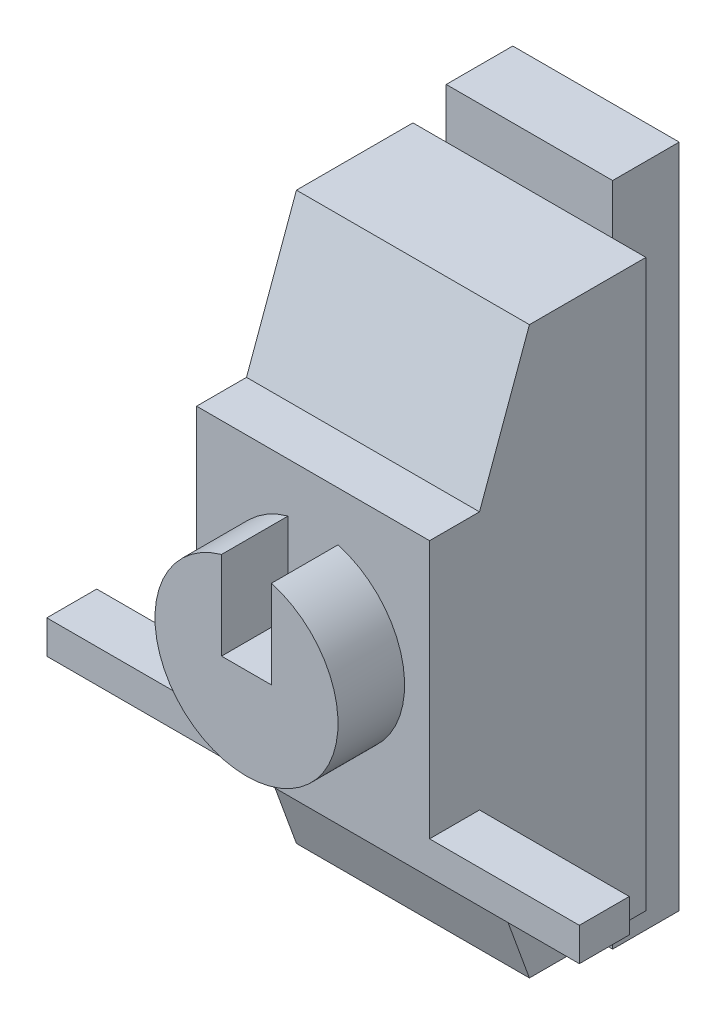
ISO-10303-21;
HEADER;
FILE_DESCRIPTION(('STEP AP214'),'2;1');
FILE_NAME('part.step','',(''),(''),'','','');
FILE_SCHEMA(('AUTOMOTIVE_DESIGN { 1 0 10303 214 1 1 1 1 }'));
ENDSEC;
DATA;
#1=APPLICATION_CONTEXT('core data for automotive mechanical design processes');
#2=APPLICATION_PROTOCOL_DEFINITION('international standard','automotive_design',2000,#1);
#3=PRODUCT_CONTEXT('',#1,'mechanical');
#4=PRODUCT('Part','Part','',(#3));
#5=PRODUCT_RELATED_PRODUCT_CATEGORY('part','',(#4));
#6=PRODUCT_DEFINITION_FORMATION('','',#4);
#7=PRODUCT_DEFINITION_CONTEXT('part definition',#1,'design');
#8=PRODUCT_DEFINITION('design','',#6,#7);
#9=PRODUCT_DEFINITION_SHAPE('','',#8);
#10=(LENGTH_UNIT() NAMED_UNIT(*) SI_UNIT(.MILLI.,.METRE.));
#11=(NAMED_UNIT(*) PLANE_ANGLE_UNIT() SI_UNIT($,.RADIAN.));
#12=(NAMED_UNIT(*) SI_UNIT($,.STERADIAN.) SOLID_ANGLE_UNIT());
#13=UNCERTAINTY_MEASURE_WITH_UNIT(LENGTH_MEASURE(1.E-05),#10,'distance_accuracy_value','');
#14=(GEOMETRIC_REPRESENTATION_CONTEXT(3) GLOBAL_UNCERTAINTY_ASSIGNED_CONTEXT((#13)) GLOBAL_UNIT_ASSIGNED_CONTEXT((#10,
#11,#12)) REPRESENTATION_CONTEXT('',''));
#15=CARTESIAN_POINT('',(0.,0.,0.));
#16=DIRECTION('',(0.,0.,1.));
#17=DIRECTION('',(1.,0.,0.));
#18=AXIS2_PLACEMENT_3D('',#15,#16,#17);
#19=CARTESIAN_POINT('',(7.,-8.75756774163604,17.));
#20=DIRECTION('',(0.,0.,-1.));
#21=DIRECTION('',(-1.,0.,0.));
#22=AXIS2_PLACEMENT_3D('',#19,#20,#21);
#23=PLANE('',#22);
#24=DIRECTION('',(0.,-1.,0.));
#25=VECTOR('',#24,1.);
#26=CARTESIAN_POINT('',(-7.,-8.75756774163604,17.));
#27=LINE('',#26,#25);
#28=CARTESIAN_POINT('',(-7.,8.75756774163604,17.));
#29=VERTEX_POINT('',#28);
#30=CARTESIAN_POINT('',(-7.,-6.75756774163604,17.));
#31=VERTEX_POINT('',#30);
#32=EDGE_CURVE('E263',#29,#31,#27,.T.);
#33=ORIENTED_EDGE('',*,*,#32,.T.);
#34=DIRECTION('',(-1.,0.,0.));
#35=VECTOR('',#34,1.);
#36=CARTESIAN_POINT('',(-16.,-6.75756774163604,17.));
#37=LINE('',#36,#35);
#38=CARTESIAN_POINT('',(-16.,-6.75756774163604,17.));
#39=VERTEX_POINT('',#38);
#40=EDGE_CURVE('E227',#31,#39,#37,.T.);
#41=ORIENTED_EDGE('',*,*,#40,.T.);
#42=DIRECTION('',(0.,-1.,0.));
#43=VECTOR('',#42,1.);
#44=CARTESIAN_POINT('',(-16.,-6.75756774163604,17.));
#45=LINE('',#44,#43);
#46=CARTESIAN_POINT('',(-16.,-8.75756774163604,17.));
#47=VERTEX_POINT('',#46);
#48=EDGE_CURVE('E252',#39,#47,#45,.T.);
#49=ORIENTED_EDGE('',*,*,#48,.T.);
#50=DIRECTION('',(-1.,0.,0.));
#51=VECTOR('',#50,1.);
#52=CARTESIAN_POINT('',(7.,-8.75756774163604,17.));
#53=LINE('',#52,#51);
#54=CARTESIAN_POINT('',(16.,-8.75756774163604,17.));
#55=VERTEX_POINT('',#54);
#56=EDGE_CURVE('E315',#55,#47,#53,.T.);
#57=ORIENTED_EDGE('',*,*,#56,.F.);
#58=DIRECTION('',(0.,-1.,0.));
#59=VECTOR('',#58,1.);
#60=CARTESIAN_POINT('',(16.,-6.75756774163604,17.));
#61=LINE('',#60,#59);
#62=CARTESIAN_POINT('',(16.,-6.75756774163604,17.));
#63=VERTEX_POINT('',#62);
#64=EDGE_CURVE('E239',#63,#55,#61,.T.);
#65=ORIENTED_EDGE('',*,*,#64,.F.);
#66=CARTESIAN_POINT('',(7.,-6.75756774163604,17.));
#67=VERTEX_POINT('',#66);
#68=EDGE_CURVE('E229',#63,#67,#37,.T.);
#69=ORIENTED_EDGE('',*,*,#68,.T.);
#70=DIRECTION('',(0.,-1.,0.));
#71=VECTOR('',#70,1.);
#72=CARTESIAN_POINT('',(7.,-8.75756774163604,17.));
#73=LINE('',#72,#71);
#74=CARTESIAN_POINT('',(7.,8.75756774163604,17.));
#75=VERTEX_POINT('',#74);
#76=EDGE_CURVE('E284',#75,#67,#73,.T.);
#77=ORIENTED_EDGE('',*,*,#76,.F.);
#78=DIRECTION('',(-1.,0.,0.));
#79=VECTOR('',#78,1.);
#80=CARTESIAN_POINT('',(7.,8.75756774163604,17.));
#81=LINE('',#80,#79);
#82=EDGE_CURVE('E317',#75,#29,#81,.T.);
#83=ORIENTED_EDGE('',*,*,#82,.T.);
#84=EDGE_LOOP('',(#33,#41,#49,#57,#65,#69,#77,#83));
#85=FACE_BOUND('',#84,.T.);
#86=CARTESIAN_POINT('',(0.,0.5,17.));
#87=DIRECTION('',(0.,0.,-1.));
#88=DIRECTION('',(-1.,0.,0.));
#89=AXIS2_PLACEMENT_3D('',#86,#87,#88);
#90=CIRCLE('',#89,5.5);
#91=CARTESIAN_POINT('',(-1.5,5.79150262212918,17.));
#92=VERTEX_POINT('',#91);
#93=CARTESIAN_POINT('',(1.5,5.79150262212918,17.));
#94=VERTEX_POINT('',#93);
#95=EDGE_CURVE('E42',#92,#94,#90,.F.);
#96=ORIENTED_EDGE('',*,*,#95,.F.);
#97=DIRECTION('',(0.,-1.,0.));
#98=VECTOR('',#97,1.);
#99=CARTESIAN_POINT('',(-1.5,0.5,17.));
#100=LINE('',#99,#98);
#101=CARTESIAN_POINT('',(-1.5,0.5,17.));
#102=VERTEX_POINT('',#101);
#103=EDGE_CURVE('E202',#92,#102,#100,.T.);
#104=ORIENTED_EDGE('',*,*,#103,.T.);
#105=DIRECTION('',(1.,0.,0.));
#106=VECTOR('',#105,1.);
#107=CARTESIAN_POINT('',(-1.5,0.5,17.));
#108=LINE('',#107,#106);
#109=CARTESIAN_POINT('',(1.5,0.5,17.));
#110=VERTEX_POINT('',#109);
#111=EDGE_CURVE('E201',#102,#110,#108,.T.);
#112=ORIENTED_EDGE('',*,*,#111,.T.);
#113=DIRECTION('',(0.,1.,0.));
#114=VECTOR('',#113,1.);
#115=CARTESIAN_POINT('',(1.5,0.5,17.));
#116=LINE('',#115,#114);
#117=EDGE_CURVE('E211',#110,#94,#116,.T.);
#118=ORIENTED_EDGE('',*,*,#117,.T.);
#119=EDGE_LOOP('',(#96,#104,#112,#118));
#120=FACE_BOUND('',#119,.T.);
#121=ADVANCED_FACE('F34',(#85,#120),#23,.F.);
#122=CARTESIAN_POINT('',(0.,0.,4.));
#123=DIRECTION('',(0.,0.,-1.));
#124=DIRECTION('',(-1.,0.,0.));
#125=AXIS2_PLACEMENT_3D('',#122,#123,#124);
#126=PLANE('',#125);
#127=DIRECTION('',(-1.,0.,0.));
#128=VECTOR('',#127,1.);
#129=CARTESIAN_POINT('',(7.,17.,4.));
#130=LINE('',#129,#128);
#131=CARTESIAN_POINT('',(5.,17.,4.));
#132=VERTEX_POINT('',#131);
#133=CARTESIAN_POINT('',(-5.,17.,4.));
#134=VERTEX_POINT('',#133);
#135=EDGE_CURVE('E305',#132,#134,#130,.T.);
#136=ORIENTED_EDGE('',*,*,#135,.F.);
#137=DIRECTION('',(0.,1.,0.));
#138=VECTOR('',#137,1.);
#139=CARTESIAN_POINT('',(5.,-20.,4.));
#140=LINE('',#139,#138);
#141=CARTESIAN_POINT('',(5.,20.,4.));
#142=VERTEX_POINT('',#141);
#143=EDGE_CURVE('E325',#132,#142,#140,.T.);
#144=ORIENTED_EDGE('',*,*,#143,.T.);
#145=DIRECTION('',(-1.,0.,0.));
#146=VECTOR('',#145,1.);
#147=CARTESIAN_POINT('',(-5.,20.,4.));
#148=LINE('',#147,#146);
#149=CARTESIAN_POINT('',(-5.,20.,4.));
#150=VERTEX_POINT('',#149);
#151=EDGE_CURVE('E323',#142,#150,#148,.T.);
#152=ORIENTED_EDGE('',*,*,#151,.T.);
#153=DIRECTION('',(0.,-1.,0.));
#154=VECTOR('',#153,1.);
#155=CARTESIAN_POINT('',(-5.,-20.,4.));
#156=LINE('',#155,#154);
#157=EDGE_CURVE('E328',#150,#134,#156,.T.);
#158=ORIENTED_EDGE('',*,*,#157,.T.);
#159=EDGE_LOOP('',(#136,#144,#152,#158));
#160=FACE_BOUND('',#159,.T.);
#161=ADVANCED_FACE('F373',(#160),#126,.F.);
#162=CARTESIAN_POINT('',(5.,-20.,4.));
#163=DIRECTION('',(-1.,0.,0.));
#164=DIRECTION('',(0.,0.,1.));
#165=AXIS2_PLACEMENT_3D('',#162,#163,#164);
#166=PLANE('',#165);
#167=DIRECTION('',(0.,1.,0.));
#168=VECTOR('',#167,1.);
#169=CARTESIAN_POINT('',(5.,-20.,0.));
#170=LINE('',#169,#168);
#171=CARTESIAN_POINT('',(5.,-20.,0.));
#172=VERTEX_POINT('',#171);
#173=CARTESIAN_POINT('',(5.,20.,0.));
#174=VERTEX_POINT('',#173);
#175=EDGE_CURVE('E319',#172,#174,#170,.T.);
#176=ORIENTED_EDGE('',*,*,#175,.T.);
#177=DIRECTION('',(0.,0.,-1.));
#178=VECTOR('',#177,1.);
#179=CARTESIAN_POINT('',(5.,20.,4.));
#180=LINE('',#179,#178);
#181=EDGE_CURVE('E350',#142,#174,#180,.T.);
#182=ORIENTED_EDGE('',*,*,#181,.F.);
#183=ORIENTED_EDGE('',*,*,#143,.F.);
#184=CARTESIAN_POINT('',(5.,-17.,4.));
#185=VERTEX_POINT('',#184);
#186=EDGE_CURVE('E324',#185,#132,#140,.T.);
#187=ORIENTED_EDGE('',*,*,#186,.F.);
#188=CARTESIAN_POINT('',(5.,-20.,4.));
#189=VERTEX_POINT('',#188);
#190=EDGE_CURVE('E320',#189,#185,#140,.T.);
#191=ORIENTED_EDGE('',*,*,#190,.F.);
#192=DIRECTION('',(0.,0.,-1.));
#193=VECTOR('',#192,1.);
#194=CARTESIAN_POINT('',(5.,-20.,4.));
#195=LINE('',#194,#193);
#196=EDGE_CURVE('E333',#189,#172,#195,.T.);
#197=ORIENTED_EDGE('',*,*,#196,.T.);
#198=EDGE_LOOP('',(#176,#182,#183,#187,#191,#197));
#199=FACE_BOUND('',#198,.T.);
#200=ADVANCED_FACE('F36',(#199),#166,.F.);
#201=CARTESIAN_POINT('',(-5.,20.,4.));
#202=DIRECTION('',(0.,-1.,0.));
#203=DIRECTION('',(0.,0.,-1.));
#204=AXIS2_PLACEMENT_3D('',#201,#202,#203);
#205=PLANE('',#204);
#206=DIRECTION('',(-1.,0.,0.));
#207=VECTOR('',#206,1.);
#208=CARTESIAN_POINT('',(-5.,20.,0.));
#209=LINE('',#208,#207);
#210=CARTESIAN_POINT('',(-5.,20.,0.));
#211=VERTEX_POINT('',#210);
#212=EDGE_CURVE('E336',#174,#211,#209,.T.);
#213=ORIENTED_EDGE('',*,*,#212,.T.);
#214=DIRECTION('',(0.,0.,-1.));
#215=VECTOR('',#214,1.);
#216=CARTESIAN_POINT('',(-5.,20.,4.));
#217=LINE('',#216,#215);
#218=EDGE_CURVE('E347',#150,#211,#217,.T.);
#219=ORIENTED_EDGE('',*,*,#218,.F.);
#220=ORIENTED_EDGE('',*,*,#151,.F.);
#221=ORIENTED_EDGE('',*,*,#181,.T.);
#222=EDGE_LOOP('',(#213,#219,#220,#221));
#223=FACE_BOUND('',#222,.T.);
#224=ADVANCED_FACE('F404',(#223),#205,.F.);
#225=CARTESIAN_POINT('',(-5.,-20.,4.));
#226=DIRECTION('',(1.,0.,0.));
#227=DIRECTION('',(0.,0.,-1.));
#228=AXIS2_PLACEMENT_3D('',#225,#226,#227);
#229=PLANE('',#228);
#230=DIRECTION('',(0.,-1.,0.));
#231=VECTOR('',#230,1.);
#232=CARTESIAN_POINT('',(-5.,-20.,0.));
#233=LINE('',#232,#231);
#234=CARTESIAN_POINT('',(-5.,-20.,0.));
#235=VERTEX_POINT('',#234);
#236=EDGE_CURVE('E338',#211,#235,#233,.T.);
#237=ORIENTED_EDGE('',*,*,#236,.T.);
#238=DIRECTION('',(0.,0.,-1.));
#239=VECTOR('',#238,1.);
#240=CARTESIAN_POINT('',(-5.,-20.,4.));
#241=LINE('',#240,#239);
#242=CARTESIAN_POINT('',(-5.,-20.,4.));
#243=VERTEX_POINT('',#242);
#244=EDGE_CURVE('E344',#243,#235,#241,.T.);
#245=ORIENTED_EDGE('',*,*,#244,.F.);
#246=CARTESIAN_POINT('',(-5.,-17.,4.));
#247=VERTEX_POINT('',#246);
#248=EDGE_CURVE('E327',#247,#243,#156,.T.);
#249=ORIENTED_EDGE('',*,*,#248,.F.);
#250=EDGE_CURVE('E331',#134,#247,#156,.T.);
#251=ORIENTED_EDGE('',*,*,#250,.F.);
#252=ORIENTED_EDGE('',*,*,#157,.F.);
#253=ORIENTED_EDGE('',*,*,#218,.T.);
#254=EDGE_LOOP('',(#237,#245,#249,#251,#252,#253));
#255=FACE_BOUND('',#254,.T.);
#256=ADVANCED_FACE('F401',(#255),#229,.F.);
#257=CARTESIAN_POINT('',(-5.,-20.,4.));
#258=DIRECTION('',(0.,1.,0.));
#259=DIRECTION('',(0.,0.,1.));
#260=AXIS2_PLACEMENT_3D('',#257,#258,#259);
#261=PLANE('',#260);
#262=DIRECTION('',(1.,0.,0.));
#263=VECTOR('',#262,1.);
#264=CARTESIAN_POINT('',(-5.,-20.,0.));
#265=LINE('',#264,#263);
#266=EDGE_CURVE('E340',#235,#172,#265,.T.);
#267=ORIENTED_EDGE('',*,*,#266,.T.);
#268=ORIENTED_EDGE('',*,*,#196,.F.);
#269=DIRECTION('',(1.,0.,0.));
#270=VECTOR('',#269,1.);
#271=CARTESIAN_POINT('',(-5.,-20.,4.));
#272=LINE('',#271,#270);
#273=EDGE_CURVE('E330',#243,#189,#272,.T.);
#274=ORIENTED_EDGE('',*,*,#273,.F.);
#275=ORIENTED_EDGE('',*,*,#244,.T.);
#276=EDGE_LOOP('',(#267,#268,#274,#275));
#277=FACE_BOUND('',#276,.T.);
#278=ADVANCED_FACE('F393',(#277),#261,.F.);
#279=ORIENTED_EDGE('',*,*,#190,.T.);
#280=DIRECTION('',(-1.,0.,0.));
#281=VECTOR('',#280,1.);
#282=CARTESIAN_POINT('',(7.,-17.,4.));
#283=LINE('',#282,#281);
#284=EDGE_CURVE('E310',#185,#247,#283,.T.);
#285=ORIENTED_EDGE('',*,*,#284,.T.);
#286=ORIENTED_EDGE('',*,*,#248,.T.);
#287=ORIENTED_EDGE('',*,*,#273,.T.);
#288=EDGE_LOOP('',(#279,#285,#286,#287));
#289=FACE_BOUND('',#288,.T.);
#290=ADVANCED_FACE('F381',(#289),#126,.F.);
#291=CARTESIAN_POINT('',(0.,0.,0.));
#292=DIRECTION('',(0.,0.,-1.));
#293=DIRECTION('',(-1.,0.,0.));
#294=AXIS2_PLACEMENT_3D('',#291,#292,#293);
#295=PLANE('',#294);
#296=ORIENTED_EDGE('',*,*,#175,.F.);
#297=ORIENTED_EDGE('',*,*,#266,.F.);
#298=ORIENTED_EDGE('',*,*,#236,.F.);
#299=ORIENTED_EDGE('',*,*,#212,.F.);
#300=EDGE_LOOP('',(#296,#297,#298,#299));
#301=FACE_BOUND('',#300,.T.);
#302=ADVANCED_FACE('F392',(#301),#295,.T.);
#303=CARTESIAN_POINT('',(7.,17.,4.));
#304=DIRECTION('',(0.,0.,1.));
#305=DIRECTION('',(1.,0.,0.));
#306=AXIS2_PLACEMENT_3D('',#303,#304,#305);
#307=PLANE('',#306);
#308=CARTESIAN_POINT('',(7.,-17.,4.));
#309=VERTEX_POINT('',#308);
#310=EDGE_CURVE('E306',#309,#185,#283,.T.);
#311=ORIENTED_EDGE('',*,*,#310,.T.);
#312=ORIENTED_EDGE('',*,*,#186,.T.);
#313=CARTESIAN_POINT('',(7.,17.,4.));
#314=VERTEX_POINT('',#313);
#315=EDGE_CURVE('E301',#314,#132,#130,.T.);
#316=ORIENTED_EDGE('',*,*,#315,.F.);
#317=DIRECTION('',(0.,1.,0.));
#318=VECTOR('',#317,1.);
#319=CARTESIAN_POINT('',(7.,17.,4.));
#320=LINE('',#319,#318);
#321=EDGE_CURVE('E290',#309,#314,#320,.T.);
#322=ORIENTED_EDGE('',*,*,#321,.F.);
#323=EDGE_LOOP('',(#311,#312,#316,#322));
#324=FACE_BOUND('',#323,.T.);
#325=ADVANCED_FACE('F397',(#324),#307,.F.);
#326=CARTESIAN_POINT('',(-7.,17.,4.));
#327=VERTEX_POINT('',#326);
#328=EDGE_CURVE('E300',#134,#327,#130,.T.);
#329=ORIENTED_EDGE('',*,*,#328,.F.);
#330=ORIENTED_EDGE('',*,*,#250,.T.);
#331=CARTESIAN_POINT('',(-7.,-17.,4.));
#332=VERTEX_POINT('',#331);
#333=EDGE_CURVE('E304',#247,#332,#283,.T.);
#334=ORIENTED_EDGE('',*,*,#333,.T.);
#335=DIRECTION('',(0.,1.,0.));
#336=VECTOR('',#335,1.);
#337=CARTESIAN_POINT('',(-7.,17.,4.));
#338=LINE('',#337,#336);
#339=EDGE_CURVE('E272',#332,#327,#338,.T.);
#340=ORIENTED_EDGE('',*,*,#339,.T.);
#341=EDGE_LOOP('',(#329,#330,#334,#340));
#342=FACE_BOUND('',#341,.T.);
#343=ADVANCED_FACE('F388',(#342),#307,.F.);
#344=CARTESIAN_POINT('',(7.,8.75756774163604,17.));
#345=DIRECTION('',(0.,-1.,0.));
#346=DIRECTION('',(0.,0.,-1.));
#347=AXIS2_PLACEMENT_3D('',#344,#345,#346);
#348=PLANE('',#347);
#349=DIRECTION('',(-1.,0.,0.));
#350=VECTOR('',#349,1.);
#351=CARTESIAN_POINT('',(7.,8.75756774163604,14.));
#352=LINE('',#351,#350);
#353=CARTESIAN_POINT('',(7.,8.75756774163604,14.));
#354=VERTEX_POINT('',#353);
#355=CARTESIAN_POINT('',(-7.,8.75756774163604,14.));
#356=VERTEX_POINT('',#355);
#357=EDGE_CURVE('E296',#354,#356,#352,.T.);
#358=ORIENTED_EDGE('',*,*,#357,.T.);
#359=DIRECTION('',(0.,0.,1.));
#360=VECTOR('',#359,1.);
#361=CARTESIAN_POINT('',(-7.,8.75756774163604,17.));
#362=LINE('',#361,#360);
#363=EDGE_CURVE('E260',#356,#29,#362,.T.);
#364=ORIENTED_EDGE('',*,*,#363,.T.);
#365=ORIENTED_EDGE('',*,*,#82,.F.);
#366=DIRECTION('',(0.,0.,1.));
#367=VECTOR('',#366,1.);
#368=CARTESIAN_POINT('',(7.,8.75756774163604,17.));
#369=LINE('',#368,#367);
#370=EDGE_CURVE('E281',#354,#75,#369,.T.);
#371=ORIENTED_EDGE('',*,*,#370,.F.);
#372=EDGE_LOOP('',(#358,#364,#365,#371));
#373=FACE_BOUND('',#372,.T.);
#374=ADVANCED_FACE('F386',(#373),#348,.F.);
#375=CARTESIAN_POINT('',(7.,-8.75756774163604,17.));
#376=DIRECTION('',(0.,1.,0.));
#377=DIRECTION('',(0.,0.,1.));
#378=AXIS2_PLACEMENT_3D('',#375,#376,#377);
#379=PLANE('',#378);
#380=ORIENTED_EDGE('',*,*,#56,.T.);
#381=DIRECTION('',(0.,0.,-1.));
#382=VECTOR('',#381,1.);
#383=CARTESIAN_POINT('',(-16.,-8.75756774163605,14.));
#384=LINE('',#383,#382);
#385=CARTESIAN_POINT('',(-16.,-8.75756774163605,14.));
#386=VERTEX_POINT('',#385);
#387=EDGE_CURVE('E242',#47,#386,#384,.T.);
#388=ORIENTED_EDGE('',*,*,#387,.T.);
#389=DIRECTION('',(1.,0.,0.));
#390=VECTOR('',#389,1.);
#391=CARTESIAN_POINT('',(-16.,-8.75756774163605,14.));
#392=LINE('',#391,#390);
#393=CARTESIAN_POINT('',(-7.,-8.75756774163605,14.));
#394=VERTEX_POINT('',#393);
#395=EDGE_CURVE('E228',#386,#394,#392,.T.);
#396=ORIENTED_EDGE('',*,*,#395,.T.);
#397=DIRECTION('',(-1.,0.,0.));
#398=VECTOR('',#397,1.);
#399=CARTESIAN_POINT('',(7.,-8.75756774163605,14.));
#400=LINE('',#399,#398);
#401=CARTESIAN_POINT('',(7.,-8.75756774163605,14.));
#402=VERTEX_POINT('',#401);
#403=EDGE_CURVE('E312',#402,#394,#400,.T.);
#404=ORIENTED_EDGE('',*,*,#403,.F.);
#405=CARTESIAN_POINT('',(16.,-8.75756774163605,14.));
#406=VERTEX_POINT('',#405);
#407=EDGE_CURVE('E245',#402,#406,#392,.T.);
#408=ORIENTED_EDGE('',*,*,#407,.T.);
#409=DIRECTION('',(0.,0.,1.));
#410=VECTOR('',#409,1.);
#411=CARTESIAN_POINT('',(16.,-8.75756774163605,14.));
#412=LINE('',#411,#410);
#413=EDGE_CURVE('E223',#406,#55,#412,.T.);
#414=ORIENTED_EDGE('',*,*,#413,.T.);
#415=EDGE_LOOP('',(#380,#388,#396,#404,#408,#414));
#416=FACE_BOUND('',#415,.T.);
#417=ADVANCED_FACE('F384',(#416),#379,.F.);
#418=CARTESIAN_POINT('',(7.,-8.75756774163605,14.));
#419=DIRECTION('',(0.,0.342020143325666,-0.939692620785909));
#420=DIRECTION('',(0.,0.939692620785909,0.342020143325666));
#421=AXIS2_PLACEMENT_3D('',#418,#419,#420);
#422=PLANE('',#421);
#423=ORIENTED_EDGE('',*,*,#403,.T.);
#424=DIRECTION('',(0.,-0.939692620785909,-0.342020143325666));
#425=VECTOR('',#424,1.);
#426=CARTESIAN_POINT('',(-7.,-8.75756774163605,14.));
#427=LINE('',#426,#425);
#428=CARTESIAN_POINT('',(-7.,-17.,11.));
#429=VERTEX_POINT('',#428);
#430=EDGE_CURVE('E266',#394,#429,#427,.T.);
#431=ORIENTED_EDGE('',*,*,#430,.T.);
#432=DIRECTION('',(-1.,0.,0.));
#433=VECTOR('',#432,1.);
#434=CARTESIAN_POINT('',(7.,-17.,11.));
#435=LINE('',#434,#433);
#436=CARTESIAN_POINT('',(7.,-17.,11.));
#437=VERTEX_POINT('',#436);
#438=EDGE_CURVE('E309',#437,#429,#435,.T.);
#439=ORIENTED_EDGE('',*,*,#438,.F.);
#440=DIRECTION('',(0.,-0.939692620785909,-0.342020143325666));
#441=VECTOR('',#440,1.);
#442=CARTESIAN_POINT('',(7.,-8.75756774163605,14.));
#443=LINE('',#442,#441);
#444=EDGE_CURVE('E286',#402,#437,#443,.T.);
#445=ORIENTED_EDGE('',*,*,#444,.F.);
#446=EDGE_LOOP('',(#423,#431,#439,#445));
#447=FACE_BOUND('',#446,.T.);
#448=ADVANCED_FACE('F448',(#447),#422,.F.);
#449=CARTESIAN_POINT('',(7.,-17.,11.));
#450=DIRECTION('',(0.,1.,0.));
#451=DIRECTION('',(0.,0.,1.));
#452=AXIS2_PLACEMENT_3D('',#449,#450,#451);
#453=PLANE('',#452);
#454=ORIENTED_EDGE('',*,*,#438,.T.);
#455=DIRECTION('',(0.,0.,-1.));
#456=VECTOR('',#455,1.);
#457=CARTESIAN_POINT('',(-7.,-17.,11.));
#458=LINE('',#457,#456);
#459=EDGE_CURVE('E269',#429,#332,#458,.T.);
#460=ORIENTED_EDGE('',*,*,#459,.T.);
#461=ORIENTED_EDGE('',*,*,#333,.F.);
#462=ORIENTED_EDGE('',*,*,#284,.F.);
#463=ORIENTED_EDGE('',*,*,#310,.F.);
#464=DIRECTION('',(0.,0.,-1.));
#465=VECTOR('',#464,1.);
#466=CARTESIAN_POINT('',(7.,-17.,11.));
#467=LINE('',#466,#465);
#468=EDGE_CURVE('E288',#437,#309,#467,.T.);
#469=ORIENTED_EDGE('',*,*,#468,.F.);
#470=EDGE_LOOP('',(#454,#460,#461,#462,#463,#469));
#471=FACE_BOUND('',#470,.T.);
#472=ADVANCED_FACE('F431',(#471),#453,.F.);
#473=CARTESIAN_POINT('',(7.,17.,11.));
#474=DIRECTION('',(0.,-1.,0.));
#475=DIRECTION('',(0.,0.,-1.));
#476=AXIS2_PLACEMENT_3D('',#473,#474,#475);
#477=PLANE('',#476);
#478=ORIENTED_EDGE('',*,*,#315,.T.);
#479=ORIENTED_EDGE('',*,*,#135,.T.);
#480=ORIENTED_EDGE('',*,*,#328,.T.);
#481=DIRECTION('',(0.,0.,1.));
#482=VECTOR('',#481,1.);
#483=CARTESIAN_POINT('',(-7.,17.,11.));
#484=LINE('',#483,#482);
#485=CARTESIAN_POINT('',(-7.,17.,11.));
#486=VERTEX_POINT('',#485);
#487=EDGE_CURVE('E275',#327,#486,#484,.T.);
#488=ORIENTED_EDGE('',*,*,#487,.T.);
#489=DIRECTION('',(-1.,0.,0.));
#490=VECTOR('',#489,1.);
#491=CARTESIAN_POINT('',(7.,17.,11.));
#492=LINE('',#491,#490);
#493=CARTESIAN_POINT('',(7.,17.,11.));
#494=VERTEX_POINT('',#493);
#495=EDGE_CURVE('E298',#494,#486,#492,.T.);
#496=ORIENTED_EDGE('',*,*,#495,.F.);
#497=DIRECTION('',(0.,0.,1.));
#498=VECTOR('',#497,1.);
#499=CARTESIAN_POINT('',(7.,17.,11.));
#500=LINE('',#499,#498);
#501=EDGE_CURVE('E292',#314,#494,#500,.T.);
#502=ORIENTED_EDGE('',*,*,#501,.F.);
#503=EDGE_LOOP('',(#478,#479,#480,#488,#496,#502));
#504=FACE_BOUND('',#503,.T.);
#505=ADVANCED_FACE('F481',(#504),#477,.F.);
#506=CARTESIAN_POINT('',(7.,8.75756774163604,14.));
#507=DIRECTION('',(0.,-0.342020143325666,-0.939692620785909));
#508=DIRECTION('',(0.,0.93969262078591,-0.342020143325666));
#509=AXIS2_PLACEMENT_3D('',#506,#507,#508);
#510=PLANE('',#509);
#511=ORIENTED_EDGE('',*,*,#495,.T.);
#512=DIRECTION('',(0.,-0.939692620785909,0.342020143325666));
#513=VECTOR('',#512,1.);
#514=CARTESIAN_POINT('',(-7.,8.75756774163604,14.));
#515=LINE('',#514,#513);
#516=EDGE_CURVE('E278',#486,#356,#515,.T.);
#517=ORIENTED_EDGE('',*,*,#516,.T.);
#518=ORIENTED_EDGE('',*,*,#357,.F.);
#519=DIRECTION('',(0.,-0.939692620785909,0.342020143325666));
#520=VECTOR('',#519,1.);
#521=CARTESIAN_POINT('',(7.,8.75756774163604,14.));
#522=LINE('',#521,#520);
#523=EDGE_CURVE('E294',#494,#354,#522,.T.);
#524=ORIENTED_EDGE('',*,*,#523,.F.);
#525=EDGE_LOOP('',(#511,#517,#518,#524));
#526=FACE_BOUND('',#525,.T.);
#527=ADVANCED_FACE('F478',(#526),#510,.F.);
#528=CARTESIAN_POINT('',(7.,0.,0.));
#529=DIRECTION('',(-1.,0.,0.));
#530=DIRECTION('',(0.,0.,1.));
#531=AXIS2_PLACEMENT_3D('',#528,#529,#530);
#532=PLANE('',#531);
#533=DIRECTION('',(0.,0.,-1.));
#534=VECTOR('',#533,1.);
#535=CARTESIAN_POINT('',(7.,-6.75756774163606,0.));
#536=LINE('',#535,#534);
#537=CARTESIAN_POINT('',(7.,-6.75756774163605,14.));
#538=VERTEX_POINT('',#537);
#539=EDGE_CURVE('E57',#67,#538,#536,.T.);
#540=ORIENTED_EDGE('',*,*,#539,.T.);
#541=DIRECTION('',(0.,-1.,0.));
#542=VECTOR('',#541,1.);
#543=CARTESIAN_POINT('',(7.,0.,14.));
#544=LINE('',#543,#542);
#545=EDGE_CURVE('E258',#538,#402,#544,.T.);
#546=ORIENTED_EDGE('',*,*,#545,.T.);
#547=ORIENTED_EDGE('',*,*,#444,.T.);
#548=ORIENTED_EDGE('',*,*,#468,.T.);
#549=ORIENTED_EDGE('',*,*,#321,.T.);
#550=ORIENTED_EDGE('',*,*,#501,.T.);
#551=ORIENTED_EDGE('',*,*,#523,.T.);
#552=ORIENTED_EDGE('',*,*,#370,.T.);
#553=ORIENTED_EDGE('',*,*,#76,.T.);
#554=EDGE_LOOP('',(#540,#546,#547,#548,#549,#550,#551,#552,#553));
#555=FACE_BOUND('',#554,.T.);
#556=ADVANCED_FACE('F437',(#555),#532,.F.);
#557=CARTESIAN_POINT('',(-7.,0.,0.));
#558=DIRECTION('',(-1.,0.,0.));
#559=DIRECTION('',(0.,0.,1.));
#560=AXIS2_PLACEMENT_3D('',#557,#558,#559);
#561=PLANE('',#560);
#562=DIRECTION('',(0.,-1.,0.));
#563=VECTOR('',#562,1.);
#564=CARTESIAN_POINT('',(-7.,0.,14.));
#565=LINE('',#564,#563);
#566=CARTESIAN_POINT('',(-7.,-6.75756774163605,14.));
#567=VERTEX_POINT('',#566);
#568=EDGE_CURVE('E355',#567,#394,#565,.T.);
#569=ORIENTED_EDGE('',*,*,#568,.F.);
#570=DIRECTION('',(0.,0.,-1.));
#571=VECTOR('',#570,1.);
#572=CARTESIAN_POINT('',(-7.,-6.75756774163606,0.));
#573=LINE('',#572,#571);
#574=EDGE_CURVE('E353',#31,#567,#573,.T.);
#575=ORIENTED_EDGE('',*,*,#574,.F.);
#576=ORIENTED_EDGE('',*,*,#32,.F.);
#577=ORIENTED_EDGE('',*,*,#363,.F.);
#578=ORIENTED_EDGE('',*,*,#516,.F.);
#579=ORIENTED_EDGE('',*,*,#487,.F.);
#580=ORIENTED_EDGE('',*,*,#339,.F.);
#581=ORIENTED_EDGE('',*,*,#459,.F.);
#582=ORIENTED_EDGE('',*,*,#430,.F.);
#583=EDGE_LOOP('',(#569,#575,#576,#577,#578,#579,#580,#581,#582));
#584=FACE_BOUND('',#583,.T.);
#585=ADVANCED_FACE('F446',(#584),#561,.T.);
#586=CARTESIAN_POINT('',(-16.,-6.75756774163605,14.));
#587=DIRECTION('',(-1.,0.,0.));
#588=DIRECTION('',(0.,0.,1.));
#589=AXIS2_PLACEMENT_3D('',#586,#587,#588);
#590=PLANE('',#589);
#591=ORIENTED_EDGE('',*,*,#387,.F.);
#592=ORIENTED_EDGE('',*,*,#48,.F.);
#593=DIRECTION('',(0.,0.,-1.));
#594=VECTOR('',#593,1.);
#595=CARTESIAN_POINT('',(-16.,-6.75756774163605,14.));
#596=LINE('',#595,#594);
#597=CARTESIAN_POINT('',(-16.,-6.75756774163605,14.));
#598=VERTEX_POINT('',#597);
#599=EDGE_CURVE('E232',#39,#598,#596,.T.);
#600=ORIENTED_EDGE('',*,*,#599,.T.);
#601=DIRECTION('',(0.,-1.,0.));
#602=VECTOR('',#601,1.);
#603=CARTESIAN_POINT('',(-16.,-6.75756774163605,14.));
#604=LINE('',#603,#602);
#605=EDGE_CURVE('E250',#598,#386,#604,.T.);
#606=ORIENTED_EDGE('',*,*,#605,.T.);
#607=EDGE_LOOP('',(#591,#592,#600,#606));
#608=FACE_BOUND('',#607,.T.);
#609=ADVANCED_FACE('F465',(#608),#590,.T.);
#610=CARTESIAN_POINT('',(0.,-6.75756774163606,0.));
#611=DIRECTION('',(0.,1.,0.));
#612=DIRECTION('',(0.,0.,1.));
#613=AXIS2_PLACEMENT_3D('',#610,#611,#612);
#614=PLANE('',#613);
#615=ORIENTED_EDGE('',*,*,#40,.F.);
#616=ORIENTED_EDGE('',*,*,#574,.T.);
#617=DIRECTION('',(1.,0.,0.));
#618=VECTOR('',#617,1.);
#619=CARTESIAN_POINT('',(-16.,-6.75756774163605,14.));
#620=LINE('',#619,#618);
#621=EDGE_CURVE('E236',#598,#567,#620,.T.);
#622=ORIENTED_EDGE('',*,*,#621,.F.);
#623=ORIENTED_EDGE('',*,*,#599,.F.);
#624=EDGE_LOOP('',(#615,#616,#622,#623));
#625=FACE_BOUND('',#624,.T.);
#626=ADVANCED_FACE('F550',(#625),#614,.T.);
#627=CARTESIAN_POINT('',(-16.,-6.75756774163605,14.));
#628=DIRECTION('',(0.,0.,-1.));
#629=DIRECTION('',(0.,1.,0.));
#630=AXIS2_PLACEMENT_3D('',#627,#628,#629);
#631=PLANE('',#630);
#632=ORIENTED_EDGE('',*,*,#621,.T.);
#633=ORIENTED_EDGE('',*,*,#568,.T.);
#634=ORIENTED_EDGE('',*,*,#395,.F.);
#635=ORIENTED_EDGE('',*,*,#605,.F.);
#636=EDGE_LOOP('',(#632,#633,#634,#635));
#637=FACE_BOUND('',#636,.T.);
#638=ADVANCED_FACE('F468',(#637),#631,.T.);
#639=ORIENTED_EDGE('',*,*,#545,.F.);
#640=CARTESIAN_POINT('',(16.,-6.75756774163605,14.));
#641=VERTEX_POINT('',#640);
#642=EDGE_CURVE('E235',#538,#641,#620,.T.);
#643=ORIENTED_EDGE('',*,*,#642,.T.);
#644=DIRECTION('',(0.,-1.,0.));
#645=VECTOR('',#644,1.);
#646=CARTESIAN_POINT('',(16.,-6.75756774163605,14.));
#647=LINE('',#646,#645);
#648=EDGE_CURVE('E247',#641,#406,#647,.T.);
#649=ORIENTED_EDGE('',*,*,#648,.T.);
#650=ORIENTED_EDGE('',*,*,#407,.F.);
#651=EDGE_LOOP('',(#639,#643,#649,#650));
#652=FACE_BOUND('',#651,.T.);
#653=ADVANCED_FACE('F455',(#652),#631,.T.);
#654=ORIENTED_EDGE('',*,*,#539,.F.);
#655=ORIENTED_EDGE('',*,*,#68,.F.);
#656=DIRECTION('',(0.,0.,1.));
#657=VECTOR('',#656,1.);
#658=CARTESIAN_POINT('',(16.,-6.75756774163605,14.));
#659=LINE('',#658,#657);
#660=EDGE_CURVE('E224',#641,#63,#659,.T.);
#661=ORIENTED_EDGE('',*,*,#660,.F.);
#662=ORIENTED_EDGE('',*,*,#642,.F.);
#663=EDGE_LOOP('',(#654,#655,#661,#662));
#664=FACE_BOUND('',#663,.T.);
#665=ADVANCED_FACE('F558',(#664),#614,.T.);
#666=CARTESIAN_POINT('',(16.,-6.75756774163605,14.));
#667=DIRECTION('',(1.,0.,0.));
#668=DIRECTION('',(0.,0.,-1.));
#669=AXIS2_PLACEMENT_3D('',#666,#667,#668);
#670=PLANE('',#669);
#671=ORIENTED_EDGE('',*,*,#413,.F.);
#672=ORIENTED_EDGE('',*,*,#648,.F.);
#673=ORIENTED_EDGE('',*,*,#660,.T.);
#674=ORIENTED_EDGE('',*,*,#64,.T.);
#675=EDGE_LOOP('',(#671,#672,#673,#674));
#676=FACE_BOUND('',#675,.T.);
#677=ADVANCED_FACE('F460',(#676),#670,.T.);
#678=CARTESIAN_POINT('',(0.,0.5,21.));
#679=DIRECTION('',(0.,0.,-1.));
#680=DIRECTION('',(-1.,0.,0.));
#681=AXIS2_PLACEMENT_3D('',#678,#679,#680);
#682=CYLINDRICAL_SURFACE('',#681,5.5);
#683=CARTESIAN_POINT('',(0.,0.5,21.));
#684=DIRECTION('',(0.,0.,1.));
#685=DIRECTION('',(1.,0.,0.));
#686=AXIS2_PLACEMENT_3D('',#683,#684,#685);
#687=CIRCLE('',#686,5.5);
#688=CARTESIAN_POINT('',(-1.5,5.79150262212918,21.));
#689=VERTEX_POINT('',#688);
#690=CARTESIAN_POINT('',(1.5,5.79150262212918,21.));
#691=VERTEX_POINT('',#690);
#692=EDGE_CURVE('E221',#689,#691,#687,.T.);
#693=ORIENTED_EDGE('',*,*,#692,.F.);
#694=DIRECTION('',(0.,0.,-1.));
#695=VECTOR('',#694,1.);
#696=CARTESIAN_POINT('',(-1.5,5.79150262212918,21.));
#697=LINE('',#696,#695);
#698=EDGE_CURVE('E194',#689,#92,#697,.T.);
#699=ORIENTED_EDGE('',*,*,#698,.T.);
#700=ORIENTED_EDGE('',*,*,#95,.T.);
#701=DIRECTION('',(0.,0.,-1.));
#702=VECTOR('',#701,1.);
#703=CARTESIAN_POINT('',(1.5,5.79150262212918,21.));
#704=LINE('',#703,#702);
#705=EDGE_CURVE('E214',#94,#691,#704,.F.);
#706=ORIENTED_EDGE('',*,*,#705,.T.);
#707=EDGE_LOOP('',(#693,#699,#700,#706));
#708=FACE_BOUND('',#707,.T.);
#709=ADVANCED_FACE('F360',(#708),#682,.T.);
#710=CARTESIAN_POINT('',(0.,0.5,21.));
#711=DIRECTION('',(0.,0.,1.));
#712=DIRECTION('',(1.,0.,0.));
#713=AXIS2_PLACEMENT_3D('',#710,#711,#712);
#714=PLANE('',#713);
#715=DIRECTION('',(0.,-1.,0.));
#716=VECTOR('',#715,1.);
#717=CARTESIAN_POINT('',(-1.5,0.5,21.));
#718=LINE('',#717,#716);
#719=CARTESIAN_POINT('',(-1.5,0.5,21.));
#720=VERTEX_POINT('',#719);
#721=EDGE_CURVE('E11',#689,#720,#718,.T.);
#722=ORIENTED_EDGE('',*,*,#721,.F.);
#723=ORIENTED_EDGE('',*,*,#692,.T.);
#724=DIRECTION('',(0.,1.,0.));
#725=VECTOR('',#724,1.);
#726=CARTESIAN_POINT('',(1.5,0.5,21.));
#727=LINE('',#726,#725);
#728=CARTESIAN_POINT('',(1.5,0.5,21.));
#729=VERTEX_POINT('',#728);
#730=EDGE_CURVE('E206',#729,#691,#727,.T.);
#731=ORIENTED_EDGE('',*,*,#730,.F.);
#732=DIRECTION('',(1.,0.,0.));
#733=VECTOR('',#732,1.);
#734=CARTESIAN_POINT('',(-1.5,0.5,21.));
#735=LINE('',#734,#733);
#736=EDGE_CURVE('E49',#720,#729,#735,.T.);
#737=ORIENTED_EDGE('',*,*,#736,.F.);
#738=EDGE_LOOP('',(#722,#723,#731,#737));
#739=FACE_BOUND('',#738,.T.);
#740=ADVANCED_FACE('F205',(#739),#714,.T.);
#741=CARTESIAN_POINT('',(-1.5,0.5,10.7350179569292));
#742=DIRECTION('',(-1.,0.,0.));
#743=DIRECTION('',(0.,0.,1.));
#744=AXIS2_PLACEMENT_3D('',#741,#742,#743);
#745=PLANE('',#744);
#746=ORIENTED_EDGE('',*,*,#721,.T.);
#747=DIRECTION('',(0.,0.,1.));
#748=VECTOR('',#747,1.);
#749=CARTESIAN_POINT('',(-1.5,0.5,10.7350179569292));
#750=LINE('',#749,#748);
#751=EDGE_CURVE('E192',#102,#720,#750,.T.);
#752=ORIENTED_EDGE('',*,*,#751,.F.);
#753=ORIENTED_EDGE('',*,*,#103,.F.);
#754=ORIENTED_EDGE('',*,*,#698,.F.);
#755=EDGE_LOOP('',(#746,#752,#753,#754));
#756=FACE_BOUND('',#755,.T.);
#757=ADVANCED_FACE('F191',(#756),#745,.F.);
#758=CARTESIAN_POINT('',(1.5,0.5,10.7350179569292));
#759=DIRECTION('',(1.,0.,0.));
#760=DIRECTION('',(0.,0.,-1.));
#761=AXIS2_PLACEMENT_3D('',#758,#759,#760);
#762=PLANE('',#761);
#763=ORIENTED_EDGE('',*,*,#117,.F.);
#764=DIRECTION('',(0.,0.,1.));
#765=VECTOR('',#764,1.);
#766=CARTESIAN_POINT('',(1.5,0.5,10.7350179569292));
#767=LINE('',#766,#765);
#768=EDGE_CURVE('E215',#110,#729,#767,.T.);
#769=ORIENTED_EDGE('',*,*,#768,.T.);
#770=ORIENTED_EDGE('',*,*,#730,.T.);
#771=ORIENTED_EDGE('',*,*,#705,.F.);
#772=EDGE_LOOP('',(#763,#769,#770,#771));
#773=FACE_BOUND('',#772,.T.);
#774=ADVANCED_FACE('F363',(#773),#762,.F.);
#775=CARTESIAN_POINT('',(-1.5,0.5,10.7350179569292));
#776=DIRECTION('',(0.,-1.,0.));
#777=DIRECTION('',(0.,0.,-1.));
#778=AXIS2_PLACEMENT_3D('',#775,#776,#777);
#779=PLANE('',#778);
#780=ORIENTED_EDGE('',*,*,#751,.T.);
#781=ORIENTED_EDGE('',*,*,#736,.T.);
#782=ORIENTED_EDGE('',*,*,#768,.F.);
#783=ORIENTED_EDGE('',*,*,#111,.F.);
#784=EDGE_LOOP('',(#780,#781,#782,#783));
#785=FACE_BOUND('',#784,.T.);
#786=ADVANCED_FACE('F199',(#785),#779,.F.);
#787=CLOSED_SHELL('',(#121,#161,#200,#224,#256,#278,#290,#302,#325,#343,#374,#417,#448,#472,
#505,#527,#556,#585,#609,#626,#638,#653,#665,#677,#709,#740,#757,#774,#786));
#788=MANIFOLD_SOLID_BREP('B2',#787);
#789=ADVANCED_BREP_SHAPE_REPRESENTATION('',(#18,#788),#14);
#790=SHAPE_DEFINITION_REPRESENTATION(#9,#789);
ENDSEC;
END-ISO-10303-21;
